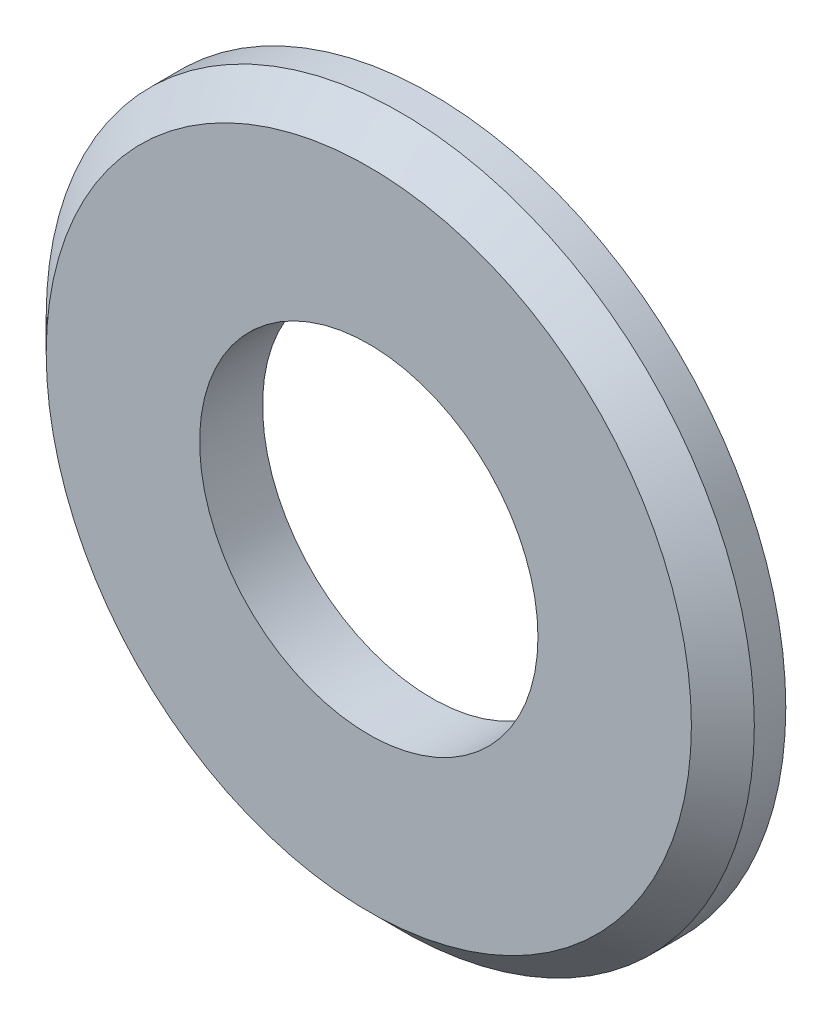
ISO-10303-21;
HEADER;
FILE_DESCRIPTION(('STEP AP214'),'2;1');
FILE_NAME('part.step','',(''),(''),'','','');
FILE_SCHEMA(('AUTOMOTIVE_DESIGN { 1 0 10303 214 1 1 1 1 }'));
ENDSEC;
DATA;
#1=APPLICATION_CONTEXT('core data for automotive mechanical design processes');
#2=APPLICATION_PROTOCOL_DEFINITION('international standard','automotive_design',2000,#1);
#3=PRODUCT_CONTEXT('',#1,'mechanical');
#4=PRODUCT('Part','Part','',(#3));
#5=PRODUCT_RELATED_PRODUCT_CATEGORY('part','',(#4));
#6=PRODUCT_DEFINITION_FORMATION('','',#4);
#7=PRODUCT_DEFINITION_CONTEXT('part definition',#1,'design');
#8=PRODUCT_DEFINITION('design','',#6,#7);
#9=PRODUCT_DEFINITION_SHAPE('','',#8);
#10=(LENGTH_UNIT() NAMED_UNIT(*) SI_UNIT(.MILLI.,.METRE.));
#11=(NAMED_UNIT(*) PLANE_ANGLE_UNIT() SI_UNIT($,.RADIAN.));
#12=(NAMED_UNIT(*) SI_UNIT($,.STERADIAN.) SOLID_ANGLE_UNIT());
#13=UNCERTAINTY_MEASURE_WITH_UNIT(LENGTH_MEASURE(1.E-05),#10,'distance_accuracy_value','');
#14=(GEOMETRIC_REPRESENTATION_CONTEXT(3) GLOBAL_UNCERTAINTY_ASSIGNED_CONTEXT((#13)) GLOBAL_UNIT_ASSIGNED_CONTEXT((#10,
#11,#12)) REPRESENTATION_CONTEXT('',''));
#15=CARTESIAN_POINT('',(0.,0.,0.));
#16=DIRECTION('',(0.,0.,1.));
#17=DIRECTION('',(1.,0.,0.));
#18=AXIS2_PLACEMENT_3D('',#15,#16,#17);
#19=CARTESIAN_POINT('',(0.,0.,0.4));
#20=DIRECTION('',(0.,0.,-1.));
#21=DIRECTION('',(-1.,0.,0.));
#22=AXIS2_PLACEMENT_3D('',#19,#20,#21);
#23=CONICAL_SURFACE('',#22,4.5,0.785398163397449);
#24=CARTESIAN_POINT('',(0.,0.,0.4));
#25=DIRECTION('',(0.,0.,-1.));
#26=DIRECTION('',(-1.,0.,0.));
#27=AXIS2_PLACEMENT_3D('',#24,#25,#26);
#28=CIRCLE('',#27,4.5);
#29=CARTESIAN_POINT('',(-4.5,0.,0.4));
#30=VERTEX_POINT('',#29);
#31=EDGE_CURVE('E63',#30,#30,#28,.T.);
#32=ORIENTED_EDGE('',*,*,#31,.F.);
#33=EDGE_LOOP('',(#32));
#34=FACE_BOUND('',#33,.T.);
#35=CARTESIAN_POINT('',(0.,0.,0.8));
#36=DIRECTION('',(0.,0.,1.));
#37=DIRECTION('',(-1.,0.,0.));
#38=AXIS2_PLACEMENT_3D('',#35,#36,#37);
#39=CIRCLE('',#38,4.1);
#40=CARTESIAN_POINT('',(-4.1,0.,0.8));
#41=VERTEX_POINT('',#40);
#42=EDGE_CURVE('E10',#41,#41,#39,.T.);
#43=ORIENTED_EDGE('',*,*,#42,.F.);
#44=EDGE_LOOP('',(#43));
#45=FACE_BOUND('',#44,.T.);
#46=ADVANCED_FACE('F15',(#34,#45),#23,.T.);
#47=CARTESIAN_POINT('',(0.,0.,0.));
#48=DIRECTION('',(0.,0.,-1.));
#49=DIRECTION('',(0.,-1.,0.));
#50=AXIS2_PLACEMENT_3D('',#47,#48,#49);
#51=PLANE('',#50);
#52=CARTESIAN_POINT('',(0.,0.,0.));
#53=DIRECTION('',(0.,0.,-1.));
#54=DIRECTION('',(1.,0.,0.));
#55=AXIS2_PLACEMENT_3D('',#52,#53,#54);
#56=CIRCLE('',#55,4.5);
#57=CARTESIAN_POINT('',(4.5,0.,0.));
#58=VERTEX_POINT('',#57);
#59=EDGE_CURVE('E25',#58,#58,#56,.T.);
#60=ORIENTED_EDGE('',*,*,#59,.T.);
#61=EDGE_LOOP('',(#60));
#62=FACE_BOUND('',#61,.T.);
#63=CARTESIAN_POINT('',(0.,0.,0.));
#64=DIRECTION('',(0.,0.,-1.));
#65=DIRECTION('',(1.,0.,0.));
#66=AXIS2_PLACEMENT_3D('',#63,#64,#65);
#67=CIRCLE('',#66,2.15);
#68=CARTESIAN_POINT('',(2.15,0.,0.));
#69=VERTEX_POINT('',#68);
#70=EDGE_CURVE('E19',#69,#69,#67,.T.);
#71=ORIENTED_EDGE('',*,*,#70,.F.);
#72=EDGE_LOOP('',(#71));
#73=FACE_BOUND('',#72,.T.);
#74=ADVANCED_FACE('F77',(#62,#73),#51,.T.);
#75=CARTESIAN_POINT('',(0.,0.,0.8));
#76=DIRECTION('',(0.,0.,-1.));
#77=DIRECTION('',(0.,-1.,0.));
#78=AXIS2_PLACEMENT_3D('',#75,#76,#77);
#79=PLANE('',#78);
#80=CARTESIAN_POINT('',(0.,0.,0.8));
#81=DIRECTION('',(0.,0.,-1.));
#82=DIRECTION('',(1.,0.,0.));
#83=AXIS2_PLACEMENT_3D('',#80,#81,#82);
#84=CIRCLE('',#83,2.15);
#85=CARTESIAN_POINT('',(2.15,0.,0.8));
#86=VERTEX_POINT('',#85);
#87=EDGE_CURVE('E54',#86,#86,#84,.T.);
#88=ORIENTED_EDGE('',*,*,#87,.T.);
#89=EDGE_LOOP('',(#88));
#90=FACE_BOUND('',#89,.T.);
#91=ORIENTED_EDGE('',*,*,#42,.T.);
#92=EDGE_LOOP('',(#91));
#93=FACE_BOUND('',#92,.T.);
#94=ADVANCED_FACE('F55',(#90,#93),#79,.F.);
#95=CARTESIAN_POINT('',(0.,0.,0.8));
#96=DIRECTION('',(0.,0.,-1.));
#97=DIRECTION('',(-1.,0.,0.));
#98=AXIS2_PLACEMENT_3D('',#95,#96,#97);
#99=CYLINDRICAL_SURFACE('',#98,4.5);
#100=ORIENTED_EDGE('',*,*,#59,.F.);
#101=EDGE_LOOP('',(#100));
#102=FACE_BOUND('',#101,.T.);
#103=ORIENTED_EDGE('',*,*,#31,.T.);
#104=EDGE_LOOP('',(#103));
#105=FACE_BOUND('',#104,.T.);
#106=ADVANCED_FACE('F73',(#102,#105),#99,.T.);
#107=CARTESIAN_POINT('',(0.,0.,0.8));
#108=DIRECTION('',(0.,0.,-1.));
#109=DIRECTION('',(-1.,0.,0.));
#110=AXIS2_PLACEMENT_3D('',#107,#108,#109);
#111=CYLINDRICAL_SURFACE('',#110,2.15);
#112=ORIENTED_EDGE('',*,*,#70,.T.);
#113=EDGE_LOOP('',(#112));
#114=FACE_BOUND('',#113,.T.);
#115=ORIENTED_EDGE('',*,*,#87,.F.);
#116=EDGE_LOOP('',(#115));
#117=FACE_BOUND('',#116,.T.);
#118=ADVANCED_FACE('F17',(#114,#117),#111,.F.);
#119=CLOSED_SHELL('',(#46,#74,#94,#106,#118));
#120=MANIFOLD_SOLID_BREP('B1',#119);
#121=ADVANCED_BREP_SHAPE_REPRESENTATION('',(#18,#120),#14);
#122=SHAPE_DEFINITION_REPRESENTATION(#9,#121);
ENDSEC;
END-ISO-10303-21;
